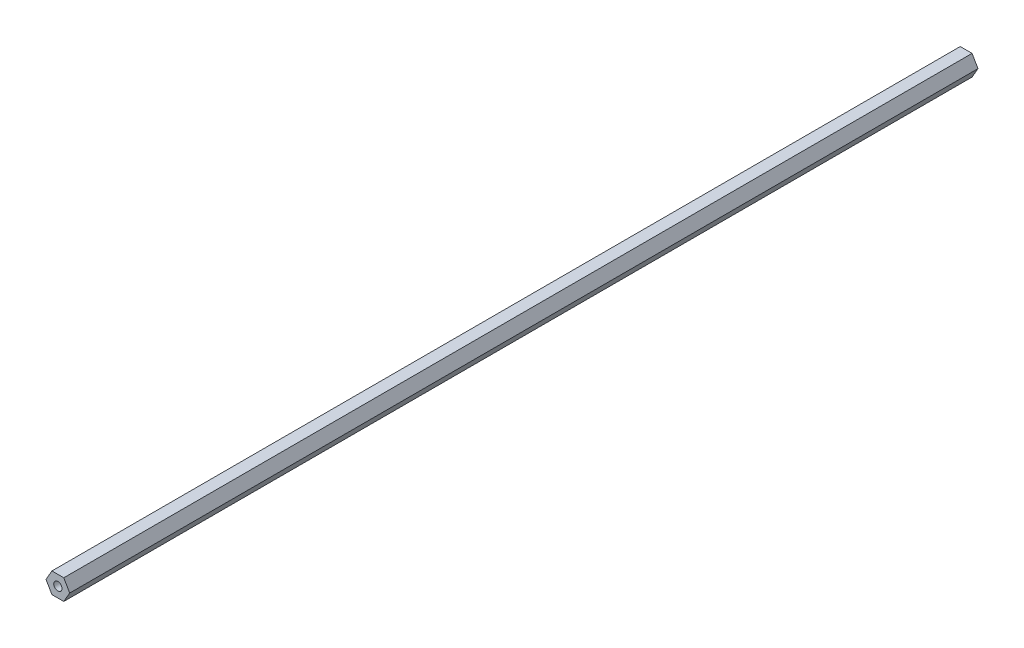
ISO-10303-21;
HEADER;
FILE_DESCRIPTION(('STEP AP214'),'2;1');
FILE_NAME('part.step','',(''),(''),'','','');
FILE_SCHEMA(('AUTOMOTIVE_DESIGN { 1 0 10303 214 1 1 1 1 }'));
ENDSEC;
DATA;
#1=APPLICATION_CONTEXT('core data for automotive mechanical design processes');
#2=APPLICATION_PROTOCOL_DEFINITION('international standard','automotive_design',2000,#1);
#3=PRODUCT_CONTEXT('',#1,'mechanical');
#4=PRODUCT('Part','Part','',(#3));
#5=PRODUCT_RELATED_PRODUCT_CATEGORY('part','',(#4));
#6=PRODUCT_DEFINITION_FORMATION('','',#4);
#7=PRODUCT_DEFINITION_CONTEXT('part definition',#1,'design');
#8=PRODUCT_DEFINITION('design','',#6,#7);
#9=PRODUCT_DEFINITION_SHAPE('','',#8);
#10=(LENGTH_UNIT() NAMED_UNIT(*) SI_UNIT(.MILLI.,.METRE.));
#11=(NAMED_UNIT(*) PLANE_ANGLE_UNIT() SI_UNIT($,.RADIAN.));
#12=(NAMED_UNIT(*) SI_UNIT($,.STERADIAN.) SOLID_ANGLE_UNIT());
#13=UNCERTAINTY_MEASURE_WITH_UNIT(LENGTH_MEASURE(1.E-05),#10,'distance_accuracy_value','');
#14=(GEOMETRIC_REPRESENTATION_CONTEXT(3) GLOBAL_UNCERTAINTY_ASSIGNED_CONTEXT((#13)) GLOBAL_UNIT_ASSIGNED_CONTEXT((#10,
#11,#12)) REPRESENTATION_CONTEXT('',''));
#15=CARTESIAN_POINT('',(0.,0.,0.));
#16=DIRECTION('',(0.,0.,1.));
#17=DIRECTION('',(1.,0.,0.));
#18=AXIS2_PLACEMENT_3D('',#15,#16,#17);
#19=CARTESIAN_POINT('',(3.66617420935418,-6.34999999999993,561.975));
#20=DIRECTION('',(-0.866025403784441,0.499999999999995,0.));
#21=DIRECTION('',(-0.499999999999995,-0.866025403784442,0.));
#22=AXIS2_PLACEMENT_3D('',#19,#20,#21);
#23=PLANE('',#22);
#24=DIRECTION('',(0.499999999999995,0.866025403784441,0.));
#25=VECTOR('',#24,1.);
#26=CARTESIAN_POINT('',(3.66617420935418,-6.34999999999993,0.));
#27=LINE('',#26,#25);
#28=CARTESIAN_POINT('',(3.66617420935418,-6.34999999999993,0.));
#29=VERTEX_POINT('',#28);
#30=CARTESIAN_POINT('',(7.33234841870822,0.,0.));
#31=VERTEX_POINT('',#30);
#32=EDGE_CURVE('E125',#29,#31,#27,.T.);
#33=ORIENTED_EDGE('',*,*,#32,.T.);
#34=DIRECTION('',(0.,0.,-1.));
#35=VECTOR('',#34,1.);
#36=CARTESIAN_POINT('',(7.33234841870822,0.,561.975));
#37=LINE('',#36,#35);
#38=CARTESIAN_POINT('',(7.33234841870822,0.,561.975));
#39=VERTEX_POINT('',#38);
#40=EDGE_CURVE('E11',#39,#31,#37,.T.);
#41=ORIENTED_EDGE('',*,*,#40,.F.);
#42=DIRECTION('',(0.499999999999995,0.866025403784441,0.));
#43=VECTOR('',#42,1.);
#44=CARTESIAN_POINT('',(3.66617420935418,-6.34999999999993,561.975));
#45=LINE('',#44,#43);
#46=CARTESIAN_POINT('',(3.66617420935418,-6.34999999999993,561.975));
#47=VERTEX_POINT('',#46);
#48=EDGE_CURVE('E136',#47,#39,#45,.T.);
#49=ORIENTED_EDGE('',*,*,#48,.F.);
#50=DIRECTION('',(0.,0.,-1.));
#51=VECTOR('',#50,1.);
#52=CARTESIAN_POINT('',(3.66617420935418,-6.34999999999993,561.975));
#53=LINE('',#52,#51);
#54=EDGE_CURVE('E121',#47,#29,#53,.T.);
#55=ORIENTED_EDGE('',*,*,#54,.T.);
#56=EDGE_LOOP('',(#33,#41,#49,#55));
#57=FACE_BOUND('',#56,.T.);
#58=ADVANCED_FACE('F38',(#57),#23,.F.);
#59=CARTESIAN_POINT('',(7.33234841870822,0.,561.975));
#60=DIRECTION('',(-0.866025403784438,-0.500000000000001,0.));
#61=DIRECTION('',(0.500000000000001,-0.866025403784438,0.));
#62=AXIS2_PLACEMENT_3D('',#59,#60,#61);
#63=PLANE('',#62);
#64=DIRECTION('',(-0.500000000000001,0.866025403784438,0.));
#65=VECTOR('',#64,1.);
#66=CARTESIAN_POINT('',(7.33234841870822,0.,0.));
#67=LINE('',#66,#65);
#68=CARTESIAN_POINT('',(3.6661742093541,6.34999999999998,0.));
#69=VERTEX_POINT('',#68);
#70=EDGE_CURVE('E128',#31,#69,#67,.T.);
#71=ORIENTED_EDGE('',*,*,#70,.T.);
#72=DIRECTION('',(0.,0.,-1.));
#73=VECTOR('',#72,1.);
#74=CARTESIAN_POINT('',(3.6661742093541,6.34999999999998,561.975));
#75=LINE('',#74,#73);
#76=CARTESIAN_POINT('',(3.6661742093541,6.34999999999998,561.975));
#77=VERTEX_POINT('',#76);
#78=EDGE_CURVE('E46',#77,#69,#75,.T.);
#79=ORIENTED_EDGE('',*,*,#78,.F.);
#80=DIRECTION('',(-0.500000000000001,0.866025403784438,0.));
#81=VECTOR('',#80,1.);
#82=CARTESIAN_POINT('',(7.33234841870822,0.,561.975));
#83=LINE('',#82,#81);
#84=EDGE_CURVE('E92',#39,#77,#83,.T.);
#85=ORIENTED_EDGE('',*,*,#84,.F.);
#86=ORIENTED_EDGE('',*,*,#40,.T.);
#87=EDGE_LOOP('',(#71,#79,#85,#86));
#88=FACE_BOUND('',#87,.T.);
#89=ADVANCED_FACE('F161',(#88),#63,.F.);
#90=CARTESIAN_POINT('',(3.6661742093541,6.34999999999998,561.975));
#91=DIRECTION('',(0.,-1.,0.));
#92=DIRECTION('',(1.,0.,0.));
#93=AXIS2_PLACEMENT_3D('',#90,#91,#92);
#94=PLANE('',#93);
#95=DIRECTION('',(-1.,0.,0.));
#96=VECTOR('',#95,1.);
#97=CARTESIAN_POINT('',(3.6661742093541,6.34999999999998,0.));
#98=LINE('',#97,#96);
#99=CARTESIAN_POINT('',(-3.66617420935414,6.34999999999996,0.));
#100=VERTEX_POINT('',#99);
#101=EDGE_CURVE('E131',#69,#100,#98,.T.);
#102=ORIENTED_EDGE('',*,*,#101,.T.);
#103=DIRECTION('',(0.,0.,-1.));
#104=VECTOR('',#103,1.);
#105=CARTESIAN_POINT('',(-3.66617420935414,6.34999999999996,561.975));
#106=LINE('',#105,#104);
#107=CARTESIAN_POINT('',(-3.66617420935414,6.34999999999996,561.975));
#108=VERTEX_POINT('',#107);
#109=EDGE_CURVE('E116',#108,#100,#106,.T.);
#110=ORIENTED_EDGE('',*,*,#109,.F.);
#111=DIRECTION('',(-1.,0.,0.));
#112=VECTOR('',#111,1.);
#113=CARTESIAN_POINT('',(3.6661742093541,6.34999999999998,561.975));
#114=LINE('',#113,#112);
#115=EDGE_CURVE('E107',#77,#108,#114,.T.);
#116=ORIENTED_EDGE('',*,*,#115,.F.);
#117=ORIENTED_EDGE('',*,*,#78,.T.);
#118=EDGE_LOOP('',(#102,#110,#116,#117));
#119=FACE_BOUND('',#118,.T.);
#120=ADVANCED_FACE('F142',(#119),#94,.F.);
#121=CARTESIAN_POINT('',(-3.66617420935414,6.34999999999996,561.975));
#122=DIRECTION('',(0.866025403784442,-0.499999999999995,0.));
#123=DIRECTION('',(0.499999999999995,0.866025403784442,0.));
#124=AXIS2_PLACEMENT_3D('',#121,#122,#123);
#125=PLANE('',#124);
#126=DIRECTION('',(-0.499999999999995,-0.866025403784442,0.));
#127=VECTOR('',#126,1.);
#128=CARTESIAN_POINT('',(-3.66617420935414,6.34999999999996,0.));
#129=LINE('',#128,#127);
#130=CARTESIAN_POINT('',(-7.33234841870822,0.,0.));
#131=VERTEX_POINT('',#130);
#132=EDGE_CURVE('E115',#100,#131,#129,.T.);
#133=ORIENTED_EDGE('',*,*,#132,.T.);
#134=DIRECTION('',(0.,0.,-1.));
#135=VECTOR('',#134,1.);
#136=CARTESIAN_POINT('',(-7.33234841870822,0.,561.975));
#137=LINE('',#136,#135);
#138=CARTESIAN_POINT('',(-7.33234841870822,0.,561.975));
#139=VERTEX_POINT('',#138);
#140=EDGE_CURVE('E112',#139,#131,#137,.T.);
#141=ORIENTED_EDGE('',*,*,#140,.F.);
#142=DIRECTION('',(-0.499999999999995,-0.866025403784442,0.));
#143=VECTOR('',#142,1.);
#144=CARTESIAN_POINT('',(-3.66617420935414,6.34999999999996,561.975));
#145=LINE('',#144,#143);
#146=EDGE_CURVE('E101',#108,#139,#145,.T.);
#147=ORIENTED_EDGE('',*,*,#146,.F.);
#148=ORIENTED_EDGE('',*,*,#109,.T.);
#149=EDGE_LOOP('',(#133,#141,#147,#148));
#150=FACE_BOUND('',#149,.T.);
#151=ADVANCED_FACE('F113',(#150),#125,.F.);
#152=CARTESIAN_POINT('',(-7.33234841870822,0.,561.975));
#153=DIRECTION('',(0.866025403784434,0.500000000000007,0.));
#154=DIRECTION('',(-0.500000000000007,0.866025403784435,0.));
#155=AXIS2_PLACEMENT_3D('',#152,#153,#154);
#156=PLANE('',#155);
#157=DIRECTION('',(0.500000000000007,-0.866025403784434,0.));
#158=VECTOR('',#157,1.);
#159=CARTESIAN_POINT('',(-7.33234841870822,0.,0.));
#160=LINE('',#159,#158);
#161=CARTESIAN_POINT('',(-3.66617420935405,-6.35000000000001,0.));
#162=VERTEX_POINT('',#161);
#163=EDGE_CURVE('E78',#131,#162,#160,.T.);
#164=ORIENTED_EDGE('',*,*,#163,.T.);
#165=DIRECTION('',(0.,0.,-1.));
#166=VECTOR('',#165,1.);
#167=CARTESIAN_POINT('',(-3.66617420935405,-6.35000000000001,561.975));
#168=LINE('',#167,#166);
#169=CARTESIAN_POINT('',(-3.66617420935405,-6.35000000000001,561.975));
#170=VERTEX_POINT('',#169);
#171=EDGE_CURVE('E117',#170,#162,#168,.T.);
#172=ORIENTED_EDGE('',*,*,#171,.F.);
#173=DIRECTION('',(0.500000000000007,-0.866025403784434,0.));
#174=VECTOR('',#173,1.);
#175=CARTESIAN_POINT('',(-7.33234841870822,0.,561.975));
#176=LINE('',#175,#174);
#177=EDGE_CURVE('E105',#139,#170,#176,.T.);
#178=ORIENTED_EDGE('',*,*,#177,.F.);
#179=ORIENTED_EDGE('',*,*,#140,.T.);
#180=EDGE_LOOP('',(#164,#172,#178,#179));
#181=FACE_BOUND('',#180,.T.);
#182=ADVANCED_FACE('F119',(#181),#156,.F.);
#183=CARTESIAN_POINT('',(-3.66617420935405,-6.35000000000001,561.975));
#184=DIRECTION('',(0.,1.,0.));
#185=DIRECTION('',(-1.,0.,0.));
#186=AXIS2_PLACEMENT_3D('',#183,#184,#185);
#187=PLANE('',#186);
#188=DIRECTION('',(1.,0.,0.));
#189=VECTOR('',#188,1.);
#190=CARTESIAN_POINT('',(-3.66617420935405,-6.35000000000001,0.));
#191=LINE('',#190,#189);
#192=EDGE_CURVE('E84',#162,#29,#191,.T.);
#193=ORIENTED_EDGE('',*,*,#192,.T.);
#194=ORIENTED_EDGE('',*,*,#54,.F.);
#195=DIRECTION('',(1.,0.,0.));
#196=VECTOR('',#195,1.);
#197=CARTESIAN_POINT('',(-3.66617420935405,-6.35000000000001,561.975));
#198=LINE('',#197,#196);
#199=EDGE_CURVE('E54',#170,#47,#198,.T.);
#200=ORIENTED_EDGE('',*,*,#199,.F.);
#201=ORIENTED_EDGE('',*,*,#171,.T.);
#202=EDGE_LOOP('',(#193,#194,#200,#201));
#203=FACE_BOUND('',#202,.T.);
#204=ADVANCED_FACE('F149',(#203),#187,.F.);
#205=CARTESIAN_POINT('',(0.,0.,561.975));
#206=DIRECTION('',(0.,0.,1.));
#207=DIRECTION('',(1.,0.,0.));
#208=AXIS2_PLACEMENT_3D('',#205,#206,#207);
#209=PLANE('',#208);
#210=CARTESIAN_POINT('',(0.,0.,561.975));
#211=DIRECTION('',(0.,0.,1.));
#212=DIRECTION('',(1.,0.,0.));
#213=AXIS2_PLACEMENT_3D('',#210,#211,#212);
#214=CIRCLE('',#213,2.55269999999999);
#215=CARTESIAN_POINT('',(2.55269999999999,0.,561.975));
#216=VERTEX_POINT('',#215);
#217=EDGE_CURVE('E257',#216,#216,#214,.T.);
#218=ORIENTED_EDGE('',*,*,#217,.F.);
#219=EDGE_LOOP('',(#218));
#220=FACE_BOUND('',#219,.T.);
#221=ORIENTED_EDGE('',*,*,#48,.T.);
#222=ORIENTED_EDGE('',*,*,#84,.T.);
#223=ORIENTED_EDGE('',*,*,#115,.T.);
#224=ORIENTED_EDGE('',*,*,#146,.T.);
#225=ORIENTED_EDGE('',*,*,#177,.T.);
#226=ORIENTED_EDGE('',*,*,#199,.T.);
#227=EDGE_LOOP('',(#221,#222,#223,#224,#225,#226));
#228=FACE_BOUND('',#227,.T.);
#229=ADVANCED_FACE('F103',(#220,#228),#209,.T.);
#230=CARTESIAN_POINT('',(0.,0.,0.));
#231=DIRECTION('',(0.,0.,1.));
#232=DIRECTION('',(1.,0.,0.));
#233=AXIS2_PLACEMENT_3D('',#230,#231,#232);
#234=PLANE('',#233);
#235=CARTESIAN_POINT('',(0.,0.,0.));
#236=DIRECTION('',(0.,0.,-1.));
#237=DIRECTION('',(-1.,0.,0.));
#238=AXIS2_PLACEMENT_3D('',#235,#236,#237);
#239=CIRCLE('',#238,2.55269999999999);
#240=CARTESIAN_POINT('',(-2.55269999999999,0.,0.));
#241=VERTEX_POINT('',#240);
#242=EDGE_CURVE('E255',#241,#241,#239,.T.);
#243=ORIENTED_EDGE('',*,*,#242,.F.);
#244=EDGE_LOOP('',(#243));
#245=FACE_BOUND('',#244,.T.);
#246=ORIENTED_EDGE('',*,*,#32,.F.);
#247=ORIENTED_EDGE('',*,*,#192,.F.);
#248=ORIENTED_EDGE('',*,*,#163,.F.);
#249=ORIENTED_EDGE('',*,*,#132,.F.);
#250=ORIENTED_EDGE('',*,*,#101,.F.);
#251=ORIENTED_EDGE('',*,*,#70,.F.);
#252=EDGE_LOOP('',(#246,#247,#248,#249,#250,#251));
#253=FACE_BOUND('',#252,.T.);
#254=ADVANCED_FACE('F145',(#245,#253),#234,.F.);
#255=CARTESIAN_POINT('',(0.,0.,545.465));
#256=DIRECTION('',(0.,0.,1.));
#257=DIRECTION('',(1.,0.,0.));
#258=AXIS2_PLACEMENT_3D('',#255,#256,#257);
#259=CONICAL_SURFACE('',#258,2.55269999999999,1.02974425867668);
#260=CARTESIAN_POINT('',(0.,0.,543.931183097808));
#261=VERTEX_POINT('',#260);
#262=VERTEX_LOOP('',#261);
#263=FACE_BOUND('',#262,.T.);
#264=CARTESIAN_POINT('',(0.,0.,545.465));
#265=DIRECTION('',(0.,0.,1.));
#266=DIRECTION('',(1.,0.,0.));
#267=AXIS2_PLACEMENT_3D('',#264,#265,#266);
#268=CIRCLE('',#267,2.55269999999999);
#269=CARTESIAN_POINT('',(2.55269999999999,0.,545.465));
#270=VERTEX_POINT('',#269);
#271=EDGE_CURVE('E129',#270,#270,#268,.T.);
#272=ORIENTED_EDGE('',*,*,#271,.T.);
#273=EDGE_LOOP('',(#272));
#274=FACE_BOUND('',#273,.T.);
#275=ADVANCED_FACE('F196',(#263,#274),#259,.F.);
#276=CARTESIAN_POINT('',(0.,0.,561.975));
#277=DIRECTION('',(0.,0.,1.));
#278=DIRECTION('',(1.,0.,0.));
#279=AXIS2_PLACEMENT_3D('',#276,#277,#278);
#280=CYLINDRICAL_SURFACE('',#279,2.55269999999999);
#281=ORIENTED_EDGE('',*,*,#271,.F.);
#282=EDGE_LOOP('',(#281));
#283=FACE_BOUND('',#282,.T.);
#284=ORIENTED_EDGE('',*,*,#217,.T.);
#285=EDGE_LOOP('',(#284));
#286=FACE_BOUND('',#285,.T.);
#287=ADVANCED_FACE('F201',(#283,#286),#280,.F.);
#288=CARTESIAN_POINT('',(0.,0.,16.51));
#289=DIRECTION('',(0.,0.,-1.));
#290=DIRECTION('',(-1.,0.,0.));
#291=AXIS2_PLACEMENT_3D('',#288,#289,#290);
#292=CONICAL_SURFACE('',#291,2.55269999999999,1.02974425867665);
#293=CARTESIAN_POINT('',(0.,0.,18.0438169021916));
#294=VERTEX_POINT('',#293);
#295=VERTEX_LOOP('',#294);
#296=FACE_BOUND('',#295,.T.);
#297=CARTESIAN_POINT('',(0.,0.,16.51));
#298=DIRECTION('',(0.,0.,-1.));
#299=DIRECTION('',(-1.,0.,0.));
#300=AXIS2_PLACEMENT_3D('',#297,#298,#299);
#301=CIRCLE('',#300,2.55269999999999);
#302=CARTESIAN_POINT('',(-2.55269999999999,0.,16.51));
#303=VERTEX_POINT('',#302);
#304=EDGE_CURVE('E252',#303,#303,#301,.T.);
#305=ORIENTED_EDGE('',*,*,#304,.T.);
#306=EDGE_LOOP('',(#305));
#307=FACE_BOUND('',#306,.T.);
#308=ADVANCED_FACE('F212',(#296,#307),#292,.F.);
#309=CARTESIAN_POINT('',(0.,0.,0.));
#310=DIRECTION('',(0.,0.,-1.));
#311=DIRECTION('',(-1.,0.,0.));
#312=AXIS2_PLACEMENT_3D('',#309,#310,#311);
#313=CYLINDRICAL_SURFACE('',#312,2.55269999999999);
#314=ORIENTED_EDGE('',*,*,#304,.F.);
#315=EDGE_LOOP('',(#314));
#316=FACE_BOUND('',#315,.T.);
#317=ORIENTED_EDGE('',*,*,#242,.T.);
#318=EDGE_LOOP('',(#317));
#319=FACE_BOUND('',#318,.T.);
#320=ADVANCED_FACE('F230',(#316,#319),#313,.F.);
#321=CLOSED_SHELL('',(#58,#89,#120,#151,#182,#204,#229,#254,#275,#287,#308,#320));
#322=MANIFOLD_SOLID_BREP('B2',#321);
#323=ADVANCED_BREP_SHAPE_REPRESENTATION('',(#18,#322),#14);
#324=SHAPE_DEFINITION_REPRESENTATION(#9,#323);
ENDSEC;
END-ISO-10303-21;
